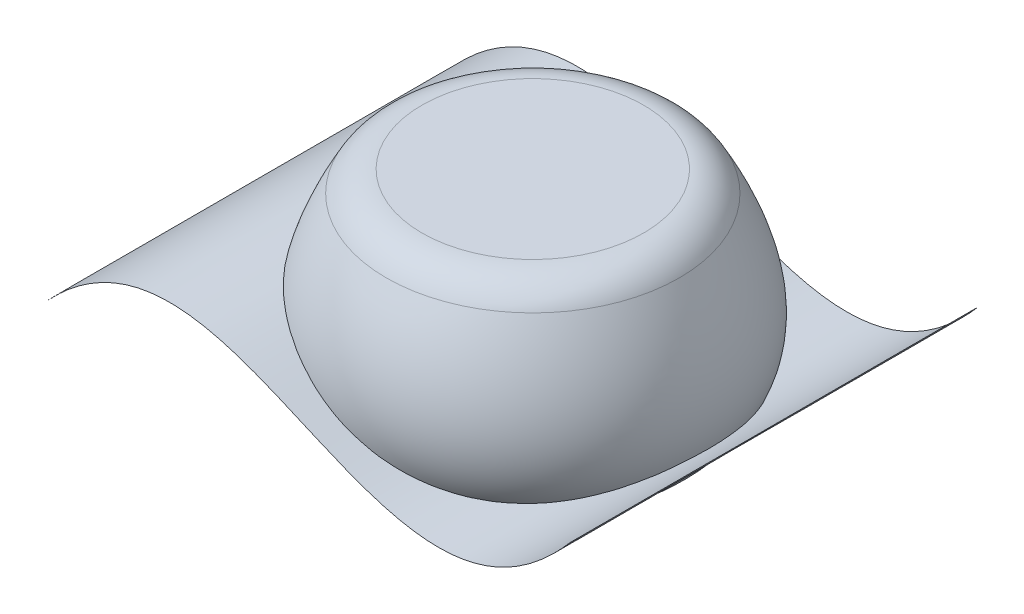
ISO-10303-21;
HEADER;
FILE_DESCRIPTION(('STEP AP214'),'2;1');
FILE_NAME('part.step','',(''),(''),'','','');
FILE_SCHEMA(('AUTOMOTIVE_DESIGN { 1 0 10303 214 1 1 1 1 }'));
ENDSEC;
DATA;
#1=APPLICATION_CONTEXT('core data for automotive mechanical design processes');
#2=APPLICATION_PROTOCOL_DEFINITION('international standard','automotive_design',2000,#1);
#3=PRODUCT_CONTEXT('',#1,'mechanical');
#4=PRODUCT('Part','Part','',(#3));
#5=PRODUCT_RELATED_PRODUCT_CATEGORY('part','',(#4));
#6=PRODUCT_DEFINITION_FORMATION('','',#4);
#7=PRODUCT_DEFINITION_CONTEXT('part definition',#1,'design');
#8=PRODUCT_DEFINITION('design','',#6,#7);
#9=PRODUCT_DEFINITION_SHAPE('','',#8);
#10=(LENGTH_UNIT() NAMED_UNIT(*) SI_UNIT(.MILLI.,.METRE.));
#11=(NAMED_UNIT(*) PLANE_ANGLE_UNIT() SI_UNIT($,.RADIAN.));
#12=(NAMED_UNIT(*) SI_UNIT($,.STERADIAN.) SOLID_ANGLE_UNIT());
#13=UNCERTAINTY_MEASURE_WITH_UNIT(LENGTH_MEASURE(1.E-05),#10,'distance_accuracy_value','');
#14=(GEOMETRIC_REPRESENTATION_CONTEXT(3) GLOBAL_UNCERTAINTY_ASSIGNED_CONTEXT((#13)) GLOBAL_UNIT_ASSIGNED_CONTEXT((#10,
#11,#12)) REPRESENTATION_CONTEXT('',''));
#15=CARTESIAN_POINT('',(0.,0.,0.));
#16=DIRECTION('',(0.,0.,1.));
#17=DIRECTION('',(1.,0.,0.));
#18=AXIS2_PLACEMENT_3D('',#15,#16,#17);
#19=CARTESIAN_POINT('',(-69.277469966941,-6.47148377102412,0.));
#20=CARTESIAN_POINT('',(-25.1471690410937,41.2236250733039,0.));
#21=CARTESIAN_POINT('',(14.801469396763,-45.1132709065495,0.));
#22=CARTESIAN_POINT('',(59.0827921122741,6.50356077127922,0.));
#23=B_SPLINE_CURVE_WITH_KNOTS('',3,(#19,#20,#21,#22),.UNSPECIFIED.,.F.,.F.,(4,4),(0.,1.),.UNSPECIFIED.);
#24=DIRECTION('',(0.,0.,1.));
#25=VECTOR('',#24,1.);
#26=SURFACE_OF_LINEAR_EXTRUSION('',#23,#25);
#27=CARTESIAN_POINT('',(-69.277469966941,-6.47148377102412,50.));
#28=CARTESIAN_POINT('',(-25.1471690410937,41.2236250733039,50.));
#29=CARTESIAN_POINT('',(14.801469396763,-45.1132709065495,50.));
#30=CARTESIAN_POINT('',(59.0827921122741,6.50356077127922,50.));
#31=B_SPLINE_CURVE_WITH_KNOTS('',3,(#27,#28,#29,#30),.UNSPECIFIED.,.F.,.F.,(4,4),(0.,1.),.UNSPECIFIED.);
#32=CARTESIAN_POINT('',(-69.277469966941,-6.47148377102412,50.));
#33=VERTEX_POINT('',#32);
#34=CARTESIAN_POINT('',(59.0827921122741,6.50356077127922,50.));
#35=VERTEX_POINT('',#34);
#36=EDGE_CURVE('E61',#33,#35,#31,.T.);
#37=ORIENTED_EDGE('',*,*,#36,.F.);
#38=DIRECTION('',(0.,0.,1.));
#39=VECTOR('',#38,1.);
#40=CARTESIAN_POINT('',(-69.277469966941,-6.47148377102412,0.));
#41=LINE('',#40,#39);
#42=CARTESIAN_POINT('',(-69.277469966941,-6.47148377102412,-50.));
#43=VERTEX_POINT('',#42);
#44=EDGE_CURVE('E53',#43,#33,#41,.T.);
#45=ORIENTED_EDGE('',*,*,#44,.F.);
#46=CARTESIAN_POINT('',(-69.277469966941,-6.47148377102412,-50.));
#47=CARTESIAN_POINT('',(-25.1471690410937,41.2236250733039,-50.));
#48=CARTESIAN_POINT('',(14.801469396763,-45.1132709065495,-50.));
#49=CARTESIAN_POINT('',(59.0827921122741,6.50356077127922,-50.));
#50=B_SPLINE_CURVE_WITH_KNOTS('',3,(#46,#47,#48,#49),.UNSPECIFIED.,.F.,.F.,(4,4),(0.,1.),.UNSPECIFIED.);
#51=CARTESIAN_POINT('',(59.0827921122741,6.50356077127922,-50.));
#52=VERTEX_POINT('',#51);
#53=EDGE_CURVE('E71',#43,#52,#50,.T.);
#54=ORIENTED_EDGE('',*,*,#53,.T.);
#55=DIRECTION('',(0.,0.,1.));
#56=VECTOR('',#55,1.);
#57=CARTESIAN_POINT('',(59.0827921122741,6.50356077127922,0.));
#58=LINE('',#57,#56);
#59=EDGE_CURVE('E12',#52,#35,#58,.T.);
#60=ORIENTED_EDGE('',*,*,#59,.T.);
#61=EDGE_LOOP('',(#37,#45,#54,#60));
#62=FACE_BOUND('',#61,.T.);
#63=ADVANCED_FACE('F51',(#62),#26,.T.);
#64=OPEN_SHELL('',(#63));
#65=SHELL_BASED_SURFACE_MODEL('B2',(#64));
#66=CARTESIAN_POINT('',(-32.8601568198395,31.2442607099683,0.));
#67=CARTESIAN_POINT('',(-66.0245526526524,-21.9410159608166,0.));
#68=CARTESIAN_POINT('',(0.,-29.9764651818748,0.));
#69=B_SPLINE_CURVE_WITH_KNOTS('',2,(#66,#67,#68),.UNSPECIFIED.,.F.,.F.,(3,3),(0.,1.),.UNSPECIFIED.);
#70=CARTESIAN_POINT('',(0.,-36.5448515190839,0.));
#71=DIRECTION('',(0.,1.,0.));
#72=AXIS1_PLACEMENT('',#70,#71);
#73=SURFACE_OF_REVOLUTION('',#69,#72);
#74=CARTESIAN_POINT('',(0.,26.0944386957487,0.));
#75=DIRECTION('',(0.,1.,0.));
#76=DIRECTION('',(0.,0.,1.));
#77=AXIS2_PLACEMENT_3D('',#74,#75,#76);
#78=CIRCLE('',#77,35.897681248424);
#79=CARTESIAN_POINT('',(0.,26.0944386957487,35.897681248424));
#80=VERTEX_POINT('',#79);
#81=EDGE_CURVE('E49',#80,#80,#78,.F.);
#82=ORIENTED_EDGE('',*,*,#81,.T.);
#83=EDGE_LOOP('',(#82));
#84=FACE_BOUND('',#83,.T.);
#85=CARTESIAN_POINT('',(0.,-29.9764651818748,0.));
#86=VERTEX_POINT('',#85);
#87=VERTEX_LOOP('',#86);
#88=FACE_BOUND('',#87,.T.);
#89=ADVANCED_FACE('F112',(#84,#88),#73,.F.);
#90=CARTESIAN_POINT('',(0.,31.2442607099683,0.));
#91=DIRECTION('',(0.,1.,0.));
#92=DIRECTION('',(0.,0.,1.));
#93=AXIS2_PLACEMENT_3D('',#90,#91,#92);
#94=PLANE('',#93);
#95=CARTESIAN_POINT('',(0.,31.2442607099683,0.));
#96=DIRECTION('',(0.,1.,0.));
#97=DIRECTION('',(0.,0.,1.));
#98=AXIS2_PLACEMENT_3D('',#95,#96,#97);
#99=CIRCLE('',#98,27.1526384522879);
#100=CARTESIAN_POINT('',(0.,31.2442607099683,27.1526384522879));
#101=VERTEX_POINT('',#100);
#102=EDGE_CURVE('E119',#101,#101,#99,.T.);
#103=ORIENTED_EDGE('',*,*,#102,.T.);
#104=EDGE_LOOP('',(#103));
#105=FACE_BOUND('',#104,.T.);
#106=ADVANCED_FACE('F123',(#105),#94,.T.);
#107=CARTESIAN_POINT('',(0.,21.2442607099683,0.));
#108=DIRECTION('',(0.,1.,0.));
#109=DIRECTION('',(0.,0.,1.));
#110=AXIS2_PLACEMENT_3D('',#107,#108,#109);
#111=TOROIDAL_SURFACE('',#110,27.1526384522879,10.);
#112=ORIENTED_EDGE('',*,*,#81,.F.);
#113=EDGE_LOOP('',(#112));
#114=FACE_BOUND('',#113,.T.);
#115=ORIENTED_EDGE('',*,*,#102,.F.);
#116=EDGE_LOOP('',(#115));
#117=FACE_BOUND('',#116,.T.);
#118=ADVANCED_FACE('F114',(#114,#117),#111,.T.);
#119=CLOSED_SHELL('',(#89,#106,#118));
#120=MANIFOLD_SOLID_BREP('B6',#119);
#121=ADVANCED_BREP_SHAPE_REPRESENTATION('',(#18,#120),#14);
#122=MANIFOLD_SURFACE_SHAPE_REPRESENTATION('',(#18,#65),#14);
#123=SHAPE_REPRESENTATION('',(#18),#14);
#124=SHAPE_DEFINITION_REPRESENTATION(#9,#123);
#125=SHAPE_REPRESENTATION_RELATIONSHIP('','',#123,#121);
#126=SHAPE_REPRESENTATION_RELATIONSHIP('','',#123,#122);
ENDSEC;
END-ISO-10303-21;
